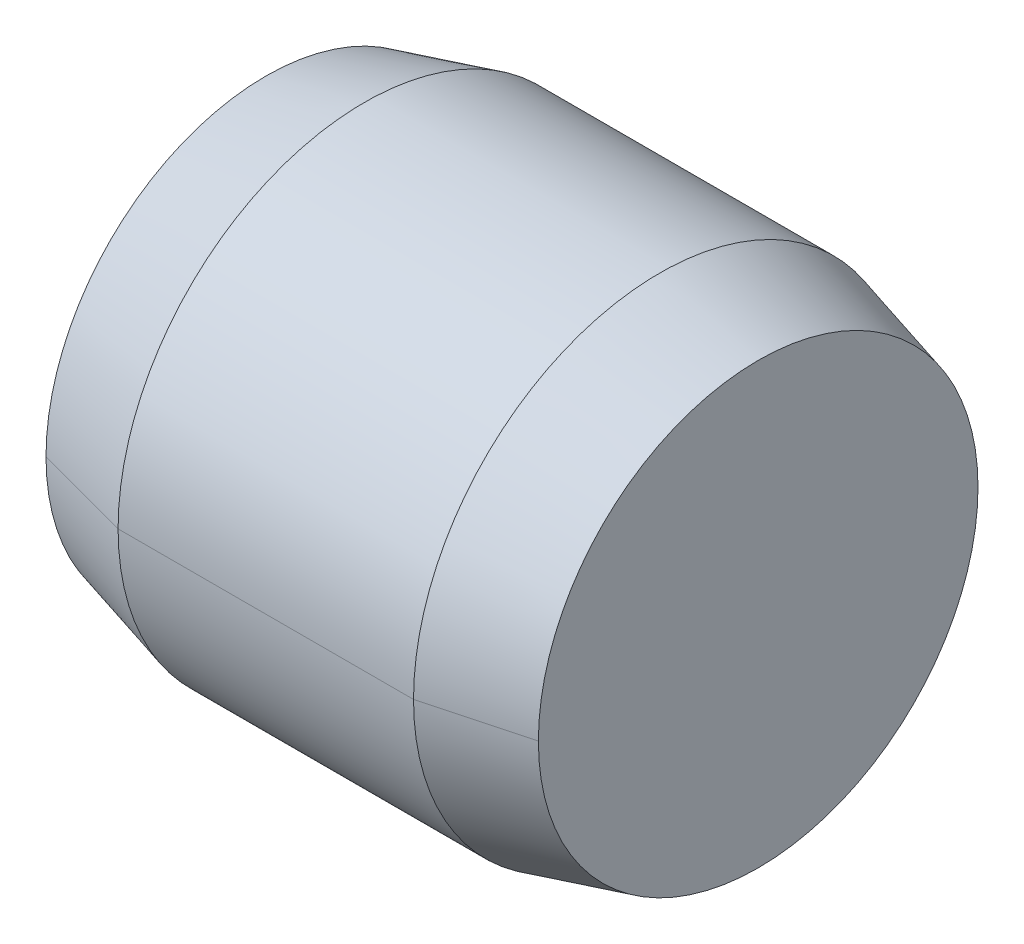
ISO-10303-21;
HEADER;
FILE_DESCRIPTION(('STEP AP214'),'2;1');
FILE_NAME('part.step','',(''),(''),'','','');
FILE_SCHEMA(('AUTOMOTIVE_DESIGN { 1 0 10303 214 1 1 1 1 }'));
ENDSEC;
DATA;
#1=APPLICATION_CONTEXT('core data for automotive mechanical design processes');
#2=APPLICATION_PROTOCOL_DEFINITION('international standard','automotive_design',2000,#1);
#3=PRODUCT_CONTEXT('',#1,'mechanical');
#4=PRODUCT('Part','Part','',(#3));
#5=PRODUCT_RELATED_PRODUCT_CATEGORY('part','',(#4));
#6=PRODUCT_DEFINITION_FORMATION('','',#4);
#7=PRODUCT_DEFINITION_CONTEXT('part definition',#1,'design');
#8=PRODUCT_DEFINITION('design','',#6,#7);
#9=PRODUCT_DEFINITION_SHAPE('','',#8);
#10=(LENGTH_UNIT() NAMED_UNIT(*) SI_UNIT(.MILLI.,.METRE.));
#11=(NAMED_UNIT(*) PLANE_ANGLE_UNIT() SI_UNIT($,.RADIAN.));
#12=(NAMED_UNIT(*) SI_UNIT($,.STERADIAN.) SOLID_ANGLE_UNIT());
#13=UNCERTAINTY_MEASURE_WITH_UNIT(LENGTH_MEASURE(1.E-05),#10,'distance_accuracy_value','');
#14=(GEOMETRIC_REPRESENTATION_CONTEXT(3) GLOBAL_UNCERTAINTY_ASSIGNED_CONTEXT((#13)) GLOBAL_UNIT_ASSIGNED_CONTEXT((#10,
#11,#12)) REPRESENTATION_CONTEXT('',''));
#15=CARTESIAN_POINT('',(0.,0.,0.));
#16=DIRECTION('',(0.,0.,1.));
#17=DIRECTION('',(1.,0.,0.));
#18=AXIS2_PLACEMENT_3D('',#15,#16,#17);
#19=CARTESIAN_POINT('',(2.,0.,0.));
#20=DIRECTION('',(1.,0.,0.));
#21=DIRECTION('',(0.,0.,-1.));
#22=AXIS2_PLACEMENT_3D('',#19,#20,#21);
#23=CONICAL_SURFACE('',#22,5.,0.261799387799143);
#24=CARTESIAN_POINT('',(0.,0.,0.));
#25=DIRECTION('',(-1.,0.,0.));
#26=DIRECTION('',(0.,0.,1.));
#27=AXIS2_PLACEMENT_3D('',#24,#25,#26);
#28=CIRCLE('',#27,4.46410161513777);
#29=CARTESIAN_POINT('',(0.,0.,4.46410161513777));
#30=VERTEX_POINT('',#29);
#31=CARTESIAN_POINT('',(0.,0.,-4.46410161513777));
#32=VERTEX_POINT('',#31);
#33=EDGE_CURVE('E107',#30,#32,#28,.T.);
#34=ORIENTED_EDGE('',*,*,#33,.F.);
#35=DIRECTION('',(0.96592582628907,0.,0.258819045102515));
#36=VECTOR('',#35,1.);
#37=CARTESIAN_POINT('',(2.,0.,5.));
#38=LINE('',#37,#36);
#39=CARTESIAN_POINT('',(2.,0.,5.));
#40=VERTEX_POINT('',#39);
#41=EDGE_CURVE('E76',#30,#40,#38,.T.);
#42=ORIENTED_EDGE('',*,*,#41,.T.);
#43=CARTESIAN_POINT('',(2.,0.,0.));
#44=DIRECTION('',(-1.,0.,0.));
#45=DIRECTION('',(0.,0.,1.));
#46=AXIS2_PLACEMENT_3D('',#43,#44,#45);
#47=CIRCLE('',#46,5.);
#48=CARTESIAN_POINT('',(2.,0.,-5.));
#49=VERTEX_POINT('',#48);
#50=EDGE_CURVE('E11',#40,#49,#47,.T.);
#51=ORIENTED_EDGE('',*,*,#50,.T.);
#52=DIRECTION('',(0.96592582628907,0.,-0.258819045102515));
#53=VECTOR('',#52,1.);
#54=CARTESIAN_POINT('',(2.,0.,-5.));
#55=LINE('',#54,#53);
#56=EDGE_CURVE('E73',#32,#49,#55,.T.);
#57=ORIENTED_EDGE('',*,*,#56,.F.);
#58=EDGE_LOOP('',(#34,#42,#51,#57));
#59=FACE_BOUND('',#58,.T.);
#60=ADVANCED_FACE('F17',(#59),#23,.T.);
#61=CARTESIAN_POINT('',(-6.35,0.,0.));
#62=DIRECTION('',(-1.,0.,0.));
#63=DIRECTION('',(0.,0.,1.));
#64=AXIS2_PLACEMENT_3D('',#61,#62,#63);
#65=CYLINDRICAL_SURFACE('',#64,5.);
#66=CARTESIAN_POINT('',(8.,0.,0.));
#67=DIRECTION('',(-1.,0.,0.));
#68=DIRECTION('',(0.,0.,1.));
#69=AXIS2_PLACEMENT_3D('',#66,#67,#68);
#70=CIRCLE('',#69,5.);
#71=CARTESIAN_POINT('',(8.,0.,5.));
#72=VERTEX_POINT('',#71);
#73=CARTESIAN_POINT('',(8.,0.,-5.));
#74=VERTEX_POINT('',#73);
#75=EDGE_CURVE('E27',#72,#74,#70,.T.);
#76=ORIENTED_EDGE('',*,*,#75,.T.);
#77=DIRECTION('',(-1.,0.,0.));
#78=VECTOR('',#77,1.);
#79=CARTESIAN_POINT('',(-6.35,0.,-5.));
#80=LINE('',#79,#78);
#81=EDGE_CURVE('E81',#74,#49,#80,.T.);
#82=ORIENTED_EDGE('',*,*,#81,.T.);
#83=ORIENTED_EDGE('',*,*,#50,.F.);
#84=DIRECTION('',(-1.,0.,0.));
#85=VECTOR('',#84,1.);
#86=CARTESIAN_POINT('',(-6.35,0.,5.));
#87=LINE('',#86,#85);
#88=EDGE_CURVE('E92',#72,#40,#87,.T.);
#89=ORIENTED_EDGE('',*,*,#88,.F.);
#90=EDGE_LOOP('',(#76,#82,#83,#89));
#91=FACE_BOUND('',#90,.T.);
#92=ADVANCED_FACE('F83',(#91),#65,.T.);
#93=CARTESIAN_POINT('',(10.,0.,0.));
#94=DIRECTION('',(-1.,0.,0.));
#95=DIRECTION('',(0.,0.,1.));
#96=AXIS2_PLACEMENT_3D('',#93,#94,#95);
#97=CONICAL_SURFACE('',#96,4.46410161513775,0.261799387799149);
#98=CARTESIAN_POINT('',(10.,0.,0.));
#99=DIRECTION('',(-1.,0.,0.));
#100=DIRECTION('',(0.,0.,1.));
#101=AXIS2_PLACEMENT_3D('',#98,#99,#100);
#102=CIRCLE('',#101,4.46410161513775);
#103=CARTESIAN_POINT('',(10.,0.,4.46410161513775));
#104=VERTEX_POINT('',#103);
#105=CARTESIAN_POINT('',(10.,0.,-4.46410161513775));
#106=VERTEX_POINT('',#105);
#107=EDGE_CURVE('E21',#104,#106,#102,.T.);
#108=ORIENTED_EDGE('',*,*,#107,.T.);
#109=DIRECTION('',(-0.965925826289068,0.,-0.258819045102521));
#110=VECTOR('',#109,1.);
#111=CARTESIAN_POINT('',(10.,0.,-4.46410161513775));
#112=LINE('',#111,#110);
#113=EDGE_CURVE('E120',#106,#74,#112,.T.);
#114=ORIENTED_EDGE('',*,*,#113,.T.);
#115=ORIENTED_EDGE('',*,*,#75,.F.);
#116=DIRECTION('',(-0.965925826289068,0.,0.258819045102521));
#117=VECTOR('',#116,1.);
#118=CARTESIAN_POINT('',(10.,0.,4.46410161513775));
#119=LINE('',#118,#117);
#120=EDGE_CURVE('E111',#104,#72,#119,.T.);
#121=ORIENTED_EDGE('',*,*,#120,.F.);
#122=EDGE_LOOP('',(#108,#114,#115,#121));
#123=FACE_BOUND('',#122,.T.);
#124=ADVANCED_FACE('F138',(#123),#97,.T.);
#125=CARTESIAN_POINT('',(0.,4.46410161513777,0.));
#126=DIRECTION('',(1.,0.,0.));
#127=DIRECTION('',(0.,1.,0.));
#128=AXIS2_PLACEMENT_3D('',#125,#126,#127);
#129=PLANE('',#128);
#130=CARTESIAN_POINT('',(0.,0.,0.));
#131=DIRECTION('',(-1.,0.,0.));
#132=DIRECTION('',(0.,0.,1.));
#133=AXIS2_PLACEMENT_3D('',#130,#131,#132);
#134=CIRCLE('',#133,4.46410161513777);
#135=EDGE_CURVE('E98',#32,#30,#134,.T.);
#136=ORIENTED_EDGE('',*,*,#135,.T.);
#137=ORIENTED_EDGE('',*,*,#33,.T.);
#138=EDGE_LOOP('',(#136,#137));
#139=FACE_BOUND('',#138,.T.);
#140=ADVANCED_FACE('F19',(#139),#129,.F.);
#141=CARTESIAN_POINT('',(10.,0.,0.));
#142=DIRECTION('',(-1.,0.,0.));
#143=DIRECTION('',(0.,0.,1.));
#144=AXIS2_PLACEMENT_3D('',#141,#142,#143);
#145=PLANE('',#144);
#146=ORIENTED_EDGE('',*,*,#107,.F.);
#147=CARTESIAN_POINT('',(10.,0.,0.));
#148=DIRECTION('',(-1.,0.,0.));
#149=DIRECTION('',(0.,0.,1.));
#150=AXIS2_PLACEMENT_3D('',#147,#148,#149);
#151=CIRCLE('',#150,4.46410161513775);
#152=EDGE_CURVE('E115',#106,#104,#151,.T.);
#153=ORIENTED_EDGE('',*,*,#152,.F.);
#154=EDGE_LOOP('',(#146,#153));
#155=FACE_BOUND('',#154,.T.);
#156=ADVANCED_FACE('F130',(#155),#145,.F.);
#157=CARTESIAN_POINT('',(10.,0.,0.));
#158=DIRECTION('',(-1.,0.,0.));
#159=DIRECTION('',(0.,0.,1.));
#160=AXIS2_PLACEMENT_3D('',#157,#158,#159);
#161=CONICAL_SURFACE('',#160,4.46410161513775,0.261799387799149);
#162=ORIENTED_EDGE('',*,*,#113,.F.);
#163=ORIENTED_EDGE('',*,*,#152,.T.);
#164=ORIENTED_EDGE('',*,*,#120,.T.);
#165=CARTESIAN_POINT('',(8.,0.,0.));
#166=DIRECTION('',(-1.,0.,0.));
#167=DIRECTION('',(0.,0.,1.));
#168=AXIS2_PLACEMENT_3D('',#165,#166,#167);
#169=CIRCLE('',#168,5.);
#170=EDGE_CURVE('E87',#74,#72,#169,.T.);
#171=ORIENTED_EDGE('',*,*,#170,.F.);
#172=EDGE_LOOP('',(#162,#163,#164,#171));
#173=FACE_BOUND('',#172,.T.);
#174=ADVANCED_FACE('F128',(#173),#161,.T.);
#175=CARTESIAN_POINT('',(-6.35,0.,0.));
#176=DIRECTION('',(-1.,0.,0.));
#177=DIRECTION('',(0.,0.,1.));
#178=AXIS2_PLACEMENT_3D('',#175,#176,#177);
#179=CYLINDRICAL_SURFACE('',#178,5.);
#180=ORIENTED_EDGE('',*,*,#81,.F.);
#181=ORIENTED_EDGE('',*,*,#170,.T.);
#182=ORIENTED_EDGE('',*,*,#88,.T.);
#183=CARTESIAN_POINT('',(2.,0.,0.));
#184=DIRECTION('',(-1.,0.,0.));
#185=DIRECTION('',(0.,0.,1.));
#186=AXIS2_PLACEMENT_3D('',#183,#184,#185);
#187=CIRCLE('',#186,5.);
#188=EDGE_CURVE('E88',#49,#40,#187,.T.);
#189=ORIENTED_EDGE('',*,*,#188,.F.);
#190=EDGE_LOOP('',(#180,#181,#182,#189));
#191=FACE_BOUND('',#190,.T.);
#192=ADVANCED_FACE('F91',(#191),#179,.T.);
#193=CARTESIAN_POINT('',(2.,0.,0.));
#194=DIRECTION('',(1.,0.,0.));
#195=DIRECTION('',(0.,0.,-1.));
#196=AXIS2_PLACEMENT_3D('',#193,#194,#195);
#197=CONICAL_SURFACE('',#196,5.,0.261799387799143);
#198=ORIENTED_EDGE('',*,*,#41,.F.);
#199=ORIENTED_EDGE('',*,*,#135,.F.);
#200=ORIENTED_EDGE('',*,*,#56,.T.);
#201=ORIENTED_EDGE('',*,*,#188,.T.);
#202=EDGE_LOOP('',(#198,#199,#200,#201));
#203=FACE_BOUND('',#202,.T.);
#204=ADVANCED_FACE('F96',(#203),#197,.T.);
#205=CLOSED_SHELL('',(#60,#92,#124,#140,#156,#174,#192,#204));
#206=MANIFOLD_SOLID_BREP('B1',#205);
#207=ADVANCED_BREP_SHAPE_REPRESENTATION('',(#18,#206),#14);
#208=SHAPE_DEFINITION_REPRESENTATION(#9,#207);
ENDSEC;
END-ISO-10303-21;
